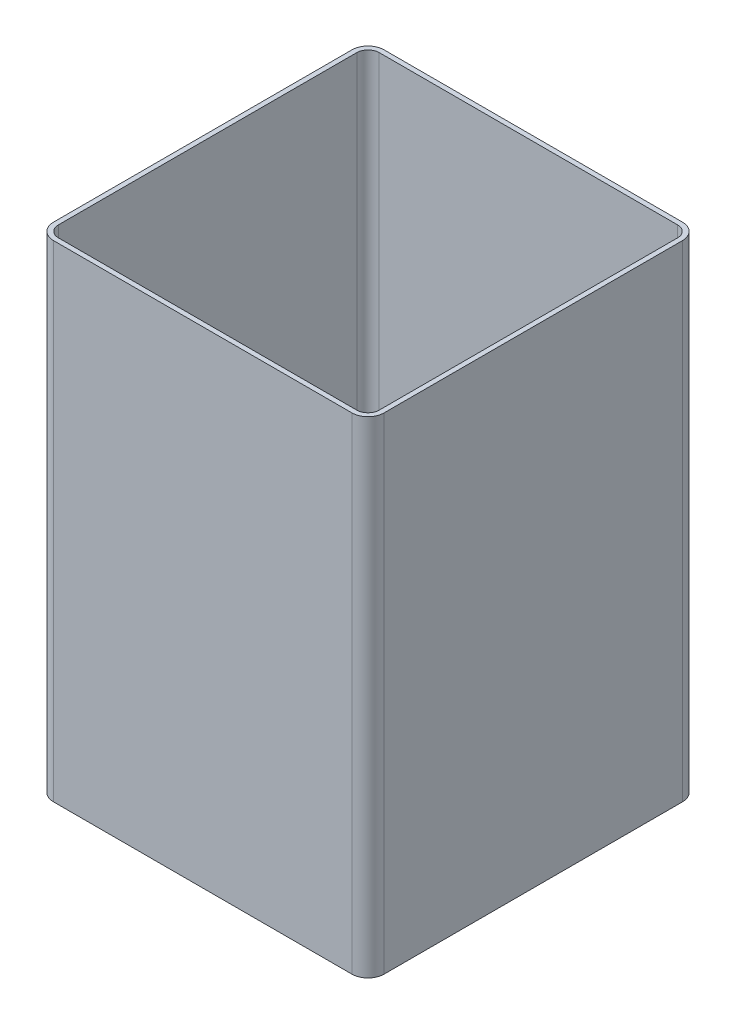
ISO-10303-21;
HEADER;
FILE_DESCRIPTION(('STEP AP214'),'2;1');
FILE_NAME('part.step','',(''),(''),'','','');
FILE_SCHEMA(('AUTOMOTIVE_DESIGN { 1 0 10303 214 1 1 1 1 }'));
ENDSEC;
DATA;
#1=APPLICATION_CONTEXT('core data for automotive mechanical design processes');
#2=APPLICATION_PROTOCOL_DEFINITION('international standard','automotive_design',2000,#1);
#3=PRODUCT_CONTEXT('',#1,'mechanical');
#4=PRODUCT('Part','Part','',(#3));
#5=PRODUCT_RELATED_PRODUCT_CATEGORY('part','',(#4));
#6=PRODUCT_DEFINITION_FORMATION('','',#4);
#7=PRODUCT_DEFINITION_CONTEXT('part definition',#1,'design');
#8=PRODUCT_DEFINITION('design','',#6,#7);
#9=PRODUCT_DEFINITION_SHAPE('','',#8);
#10=(LENGTH_UNIT() NAMED_UNIT(*) SI_UNIT(.MILLI.,.METRE.));
#11=(NAMED_UNIT(*) PLANE_ANGLE_UNIT() SI_UNIT($,.RADIAN.));
#12=(NAMED_UNIT(*) SI_UNIT($,.STERADIAN.) SOLID_ANGLE_UNIT());
#13=UNCERTAINTY_MEASURE_WITH_UNIT(LENGTH_MEASURE(1.E-05),#10,'distance_accuracy_value','');
#14=(GEOMETRIC_REPRESENTATION_CONTEXT(3) GLOBAL_UNCERTAINTY_ASSIGNED_CONTEXT((#13)) GLOBAL_UNIT_ASSIGNED_CONTEXT((#10,
#11,#12)) REPRESENTATION_CONTEXT('',''));
#15=CARTESIAN_POINT('',(0.,0.,0.));
#16=DIRECTION('',(0.,0.,1.));
#17=DIRECTION('',(1.,0.,0.));
#18=AXIS2_PLACEMENT_3D('',#15,#16,#17);
#19=CARTESIAN_POINT('',(103.,303.,103.));
#20=DIRECTION('',(-1.,0.,0.));
#21=DIRECTION('',(0.,0.,1.));
#22=AXIS2_PLACEMENT_3D('',#19,#20,#21);
#23=PLANE('',#22);
#24=DIRECTION('',(0.,0.,-1.));
#25=VECTOR('',#24,1.);
#26=CARTESIAN_POINT('',(103.,0.,103.));
#27=LINE('',#26,#25);
#28=CARTESIAN_POINT('',(103.,0.,93.));
#29=VERTEX_POINT('',#28);
#30=CARTESIAN_POINT('',(103.,0.,-93.));
#31=VERTEX_POINT('',#30);
#32=EDGE_CURVE('E208',#29,#31,#27,.T.);
#33=ORIENTED_EDGE('',*,*,#32,.T.);
#34=DIRECTION('',(0.,-1.,0.));
#35=VECTOR('',#34,1.);
#36=CARTESIAN_POINT('',(103.,303.,-93.));
#37=LINE('',#36,#35);
#38=CARTESIAN_POINT('',(103.,303.,-93.));
#39=VERTEX_POINT('',#38);
#40=EDGE_CURVE('E305',#31,#39,#37,.F.);
#41=ORIENTED_EDGE('',*,*,#40,.T.);
#42=DIRECTION('',(0.,0.,-1.));
#43=VECTOR('',#42,1.);
#44=CARTESIAN_POINT('',(103.,303.,103.));
#45=LINE('',#44,#43);
#46=CARTESIAN_POINT('',(103.,303.,93.));
#47=VERTEX_POINT('',#46);
#48=EDGE_CURVE('E234',#47,#39,#45,.T.);
#49=ORIENTED_EDGE('',*,*,#48,.F.);
#50=DIRECTION('',(0.,-1.,0.));
#51=VECTOR('',#50,1.);
#52=CARTESIAN_POINT('',(103.,303.,93.));
#53=LINE('',#52,#51);
#54=EDGE_CURVE('E301',#47,#29,#53,.T.);
#55=ORIENTED_EDGE('',*,*,#54,.T.);
#56=EDGE_LOOP('',(#33,#41,#49,#55));
#57=FACE_BOUND('',#56,.T.);
#58=ADVANCED_FACE('F39',(#57),#23,.F.);
#59=CARTESIAN_POINT('',(-103.,303.,-103.));
#60=DIRECTION('',(0.,0.,1.));
#61=DIRECTION('',(1.,0.,0.));
#62=AXIS2_PLACEMENT_3D('',#59,#60,#61);
#63=PLANE('',#62);
#64=DIRECTION('',(-1.,0.,0.));
#65=VECTOR('',#64,1.);
#66=CARTESIAN_POINT('',(-103.,0.,-103.));
#67=LINE('',#66,#65);
#68=CARTESIAN_POINT('',(93.,0.,-103.));
#69=VERTEX_POINT('',#68);
#70=CARTESIAN_POINT('',(-93.,0.,-103.));
#71=VERTEX_POINT('',#70);
#72=EDGE_CURVE('E254',#69,#71,#67,.T.);
#73=ORIENTED_EDGE('',*,*,#72,.T.);
#74=DIRECTION('',(0.,-1.,0.));
#75=VECTOR('',#74,1.);
#76=CARTESIAN_POINT('',(-93.,303.,-103.));
#77=LINE('',#76,#75);
#78=CARTESIAN_POINT('',(-93.,303.,-103.));
#79=VERTEX_POINT('',#78);
#80=EDGE_CURVE('E286',#71,#79,#77,.F.);
#81=ORIENTED_EDGE('',*,*,#80,.T.);
#82=DIRECTION('',(-1.,0.,0.));
#83=VECTOR('',#82,1.);
#84=CARTESIAN_POINT('',(-103.,303.,-103.));
#85=LINE('',#84,#83);
#86=CARTESIAN_POINT('',(93.,303.,-103.));
#87=VERTEX_POINT('',#86);
#88=EDGE_CURVE('E238',#87,#79,#85,.T.);
#89=ORIENTED_EDGE('',*,*,#88,.F.);
#90=DIRECTION('',(0.,-1.,0.));
#91=VECTOR('',#90,1.);
#92=CARTESIAN_POINT('',(93.,303.,-103.));
#93=LINE('',#92,#91);
#94=EDGE_CURVE('E282',#87,#69,#93,.T.);
#95=ORIENTED_EDGE('',*,*,#94,.T.);
#96=EDGE_LOOP('',(#73,#81,#89,#95));
#97=FACE_BOUND('',#96,.T.);
#98=ADVANCED_FACE('F351',(#97),#63,.F.);
#99=CARTESIAN_POINT('',(-103.,303.,103.));
#100=DIRECTION('',(1.,0.,0.));
#101=DIRECTION('',(0.,0.,-1.));
#102=AXIS2_PLACEMENT_3D('',#99,#100,#101);
#103=PLANE('',#102);
#104=DIRECTION('',(0.,0.,1.));
#105=VECTOR('',#104,1.);
#106=CARTESIAN_POINT('',(-103.,303.,103.));
#107=LINE('',#106,#105);
#108=CARTESIAN_POINT('',(-103.,303.,-93.));
#109=VERTEX_POINT('',#108);
#110=CARTESIAN_POINT('',(-103.,303.,93.));
#111=VERTEX_POINT('',#110);
#112=EDGE_CURVE('E243',#109,#111,#107,.T.);
#113=ORIENTED_EDGE('',*,*,#112,.F.);
#114=DIRECTION('',(0.,-1.,0.));
#115=VECTOR('',#114,1.);
#116=CARTESIAN_POINT('',(-103.,303.,-93.));
#117=LINE('',#116,#115);
#118=CARTESIAN_POINT('',(-103.,0.,-93.));
#119=VERTEX_POINT('',#118);
#120=EDGE_CURVE('E266',#109,#119,#117,.T.);
#121=ORIENTED_EDGE('',*,*,#120,.T.);
#122=DIRECTION('',(0.,0.,1.));
#123=VECTOR('',#122,1.);
#124=CARTESIAN_POINT('',(-103.,0.,103.));
#125=LINE('',#124,#123);
#126=CARTESIAN_POINT('',(-103.,0.,93.));
#127=VERTEX_POINT('',#126);
#128=EDGE_CURVE('E258',#119,#127,#125,.T.);
#129=ORIENTED_EDGE('',*,*,#128,.T.);
#130=DIRECTION('',(0.,-1.,0.));
#131=VECTOR('',#130,1.);
#132=CARTESIAN_POINT('',(-103.,303.,93.));
#133=LINE('',#132,#131);
#134=EDGE_CURVE('E250',#127,#111,#133,.F.);
#135=ORIENTED_EDGE('',*,*,#134,.T.);
#136=EDGE_LOOP('',(#113,#121,#129,#135));
#137=FACE_BOUND('',#136,.T.);
#138=ADVANCED_FACE('F357',(#137),#103,.F.);
#139=CARTESIAN_POINT('',(-103.,303.,103.));
#140=DIRECTION('',(0.,0.,-1.));
#141=DIRECTION('',(-1.,0.,0.));
#142=AXIS2_PLACEMENT_3D('',#139,#140,#141);
#143=PLANE('',#142);
#144=DIRECTION('',(1.,0.,0.));
#145=VECTOR('',#144,1.);
#146=CARTESIAN_POINT('',(-103.,303.,103.));
#147=LINE('',#146,#145);
#148=CARTESIAN_POINT('',(-93.,303.,103.));
#149=VERTEX_POINT('',#148);
#150=CARTESIAN_POINT('',(93.,303.,103.));
#151=VERTEX_POINT('',#150);
#152=EDGE_CURVE('E247',#149,#151,#147,.T.);
#153=ORIENTED_EDGE('',*,*,#152,.F.);
#154=DIRECTION('',(0.,-1.,0.));
#155=VECTOR('',#154,1.);
#156=CARTESIAN_POINT('',(-93.,303.,103.));
#157=LINE('',#156,#155);
#158=CARTESIAN_POINT('',(-93.,0.,103.));
#159=VERTEX_POINT('',#158);
#160=EDGE_CURVE('E11',#149,#159,#157,.T.);
#161=ORIENTED_EDGE('',*,*,#160,.T.);
#162=DIRECTION('',(1.,0.,0.));
#163=VECTOR('',#162,1.);
#164=CARTESIAN_POINT('',(-103.,0.,103.));
#165=LINE('',#164,#163);
#166=CARTESIAN_POINT('',(93.,0.,103.));
#167=VERTEX_POINT('',#166);
#168=EDGE_CURVE('E239',#159,#167,#165,.T.);
#169=ORIENTED_EDGE('',*,*,#168,.T.);
#170=DIRECTION('',(0.,-1.,0.));
#171=VECTOR('',#170,1.);
#172=CARTESIAN_POINT('',(93.,303.,103.));
#173=LINE('',#172,#171);
#174=EDGE_CURVE('E48',#167,#151,#173,.F.);
#175=ORIENTED_EDGE('',*,*,#174,.T.);
#176=EDGE_LOOP('',(#153,#161,#169,#175));
#177=FACE_BOUND('',#176,.T.);
#178=ADVANCED_FACE('F382',(#177),#143,.F.);
#179=CARTESIAN_POINT('',(0.,303.,0.));
#180=DIRECTION('',(0.,-1.,0.));
#181=DIRECTION('',(0.,0.,-1.));
#182=AXIS2_PLACEMENT_3D('',#179,#180,#181);
#183=PLANE('',#182);
#184=DIRECTION('',(-1.,0.,0.));
#185=VECTOR('',#184,1.);
#186=CARTESIAN_POINT('',(0.,303.,-100.));
#187=LINE('',#186,#185);
#188=CARTESIAN_POINT('',(93.,303.,-100.));
#189=VERTEX_POINT('',#188);
#190=CARTESIAN_POINT('',(-93.,303.,-100.));
#191=VERTEX_POINT('',#190);
#192=EDGE_CURVE('E183',#189,#191,#187,.T.);
#193=ORIENTED_EDGE('',*,*,#192,.F.);
#194=CARTESIAN_POINT('',(93.,303.,-93.));
#195=DIRECTION('',(0.,-1.,0.));
#196=DIRECTION('',(0.,0.,-1.));
#197=AXIS2_PLACEMENT_3D('',#194,#195,#196);
#198=CIRCLE('',#197,7.);
#199=CARTESIAN_POINT('',(100.,303.,-93.));
#200=VERTEX_POINT('',#199);
#201=EDGE_CURVE('E216',#200,#189,#198,.F.);
#202=ORIENTED_EDGE('',*,*,#201,.F.);
#203=DIRECTION('',(0.,0.,-1.));
#204=VECTOR('',#203,1.);
#205=CARTESIAN_POINT('',(100.,303.,0.));
#206=LINE('',#205,#204);
#207=CARTESIAN_POINT('',(100.,303.,93.));
#208=VERTEX_POINT('',#207);
#209=EDGE_CURVE('E55',#208,#200,#206,.T.);
#210=ORIENTED_EDGE('',*,*,#209,.F.);
#211=CARTESIAN_POINT('',(93.,303.,93.));
#212=DIRECTION('',(0.,-1.,0.));
#213=DIRECTION('',(0.,0.,-1.));
#214=AXIS2_PLACEMENT_3D('',#211,#212,#213);
#215=CIRCLE('',#214,7.);
#216=CARTESIAN_POINT('',(93.,303.,100.));
#217=VERTEX_POINT('',#216);
#218=EDGE_CURVE('E186',#217,#208,#215,.F.);
#219=ORIENTED_EDGE('',*,*,#218,.F.);
#220=DIRECTION('',(1.,0.,0.));
#221=VECTOR('',#220,1.);
#222=CARTESIAN_POINT('',(0.,303.,100.));
#223=LINE('',#222,#221);
#224=CARTESIAN_POINT('',(-93.,303.,100.));
#225=VERTEX_POINT('',#224);
#226=EDGE_CURVE('E203',#225,#217,#223,.T.);
#227=ORIENTED_EDGE('',*,*,#226,.F.);
#228=CARTESIAN_POINT('',(-93.,303.,93.));
#229=DIRECTION('',(0.,-1.,0.));
#230=DIRECTION('',(0.,0.,-1.));
#231=AXIS2_PLACEMENT_3D('',#228,#229,#230);
#232=CIRCLE('',#231,7.);
#233=CARTESIAN_POINT('',(-100.,303.,93.));
#234=VERTEX_POINT('',#233);
#235=EDGE_CURVE('E190',#234,#225,#232,.F.);
#236=ORIENTED_EDGE('',*,*,#235,.F.);
#237=DIRECTION('',(0.,0.,1.));
#238=VECTOR('',#237,1.);
#239=CARTESIAN_POINT('',(-100.,303.,0.));
#240=LINE('',#239,#238);
#241=CARTESIAN_POINT('',(-100.,303.,-93.));
#242=VERTEX_POINT('',#241);
#243=EDGE_CURVE('E222',#242,#234,#240,.T.);
#244=ORIENTED_EDGE('',*,*,#243,.F.);
#245=CARTESIAN_POINT('',(-93.,303.,-93.));
#246=DIRECTION('',(0.,-1.,0.));
#247=DIRECTION('',(0.,0.,-1.));
#248=AXIS2_PLACEMENT_3D('',#245,#246,#247);
#249=CIRCLE('',#248,7.);
#250=EDGE_CURVE('E219',#191,#242,#249,.F.);
#251=ORIENTED_EDGE('',*,*,#250,.F.);
#252=EDGE_LOOP('',(#193,#202,#210,#219,#227,#236,#244,#251));
#253=FACE_BOUND('',#252,.T.);
#254=ORIENTED_EDGE('',*,*,#88,.T.);
#255=CARTESIAN_POINT('',(-93.,303.,-93.));
#256=DIRECTION('',(0.,-1.,0.));
#257=DIRECTION('',(0.,0.,-1.));
#258=AXIS2_PLACEMENT_3D('',#255,#256,#257);
#259=CIRCLE('',#258,10.);
#260=EDGE_CURVE('E298',#79,#109,#259,.F.);
#261=ORIENTED_EDGE('',*,*,#260,.T.);
#262=ORIENTED_EDGE('',*,*,#112,.T.);
#263=CARTESIAN_POINT('',(-93.,303.,93.));
#264=DIRECTION('',(0.,-1.,0.));
#265=DIRECTION('',(0.,0.,-1.));
#266=AXIS2_PLACEMENT_3D('',#263,#264,#265);
#267=CIRCLE('',#266,10.);
#268=EDGE_CURVE('E292',#111,#149,#267,.F.);
#269=ORIENTED_EDGE('',*,*,#268,.T.);
#270=ORIENTED_EDGE('',*,*,#152,.T.);
#271=CARTESIAN_POINT('',(93.,303.,93.));
#272=DIRECTION('',(0.,-1.,0.));
#273=DIRECTION('',(0.,0.,-1.));
#274=AXIS2_PLACEMENT_3D('',#271,#272,#273);
#275=CIRCLE('',#274,10.);
#276=EDGE_CURVE('E289',#151,#47,#275,.F.);
#277=ORIENTED_EDGE('',*,*,#276,.T.);
#278=ORIENTED_EDGE('',*,*,#48,.T.);
#279=CARTESIAN_POINT('',(93.,303.,-93.));
#280=DIRECTION('',(0.,-1.,0.));
#281=DIRECTION('',(0.,0.,-1.));
#282=AXIS2_PLACEMENT_3D('',#279,#280,#281);
#283=CIRCLE('',#282,10.);
#284=EDGE_CURVE('E295',#39,#87,#283,.F.);
#285=ORIENTED_EDGE('',*,*,#284,.T.);
#286=EDGE_LOOP('',(#254,#261,#262,#269,#270,#277,#278,#285));
#287=FACE_BOUND('',#286,.T.);
#288=ADVANCED_FACE('F335',(#253,#287),#183,.F.);
#289=CARTESIAN_POINT('',(0.,0.,0.));
#290=DIRECTION('',(0.,-1.,0.));
#291=DIRECTION('',(0.,0.,-1.));
#292=AXIS2_PLACEMENT_3D('',#289,#290,#291);
#293=PLANE('',#292);
#294=ORIENTED_EDGE('',*,*,#128,.F.);
#295=CARTESIAN_POINT('',(-93.,0.,-93.));
#296=DIRECTION('',(0.,-1.,0.));
#297=DIRECTION('',(0.,0.,-1.));
#298=AXIS2_PLACEMENT_3D('',#295,#296,#297);
#299=CIRCLE('',#298,10.);
#300=EDGE_CURVE('E279',#119,#71,#299,.T.);
#301=ORIENTED_EDGE('',*,*,#300,.T.);
#302=ORIENTED_EDGE('',*,*,#72,.F.);
#303=CARTESIAN_POINT('',(93.,0.,-93.));
#304=DIRECTION('',(0.,-1.,0.));
#305=DIRECTION('',(0.,0.,-1.));
#306=AXIS2_PLACEMENT_3D('',#303,#304,#305);
#307=CIRCLE('',#306,10.);
#308=EDGE_CURVE('E276',#69,#31,#307,.T.);
#309=ORIENTED_EDGE('',*,*,#308,.T.);
#310=ORIENTED_EDGE('',*,*,#32,.F.);
#311=CARTESIAN_POINT('',(93.,0.,93.));
#312=DIRECTION('',(0.,-1.,0.));
#313=DIRECTION('',(0.,0.,-1.));
#314=AXIS2_PLACEMENT_3D('',#311,#312,#313);
#315=CIRCLE('',#314,10.);
#316=EDGE_CURVE('E270',#29,#167,#315,.T.);
#317=ORIENTED_EDGE('',*,*,#316,.T.);
#318=ORIENTED_EDGE('',*,*,#168,.F.);
#319=CARTESIAN_POINT('',(-93.,0.,93.));
#320=DIRECTION('',(0.,-1.,0.));
#321=DIRECTION('',(0.,0.,-1.));
#322=AXIS2_PLACEMENT_3D('',#319,#320,#321);
#323=CIRCLE('',#322,10.);
#324=EDGE_CURVE('E273',#159,#127,#323,.T.);
#325=ORIENTED_EDGE('',*,*,#324,.T.);
#326=EDGE_LOOP('',(#294,#301,#302,#309,#310,#317,#318,#325));
#327=FACE_BOUND('',#326,.T.);
#328=ADVANCED_FACE('F366',(#327),#293,.T.);
#329=CARTESIAN_POINT('',(-93.,303.,-93.));
#330=DIRECTION('',(0.,-1.,0.));
#331=DIRECTION('',(0.,0.,-1.));
#332=AXIS2_PLACEMENT_3D('',#329,#330,#331);
#333=CYLINDRICAL_SURFACE('',#332,10.);
#334=ORIENTED_EDGE('',*,*,#260,.F.);
#335=ORIENTED_EDGE('',*,*,#80,.F.);
#336=ORIENTED_EDGE('',*,*,#300,.F.);
#337=ORIENTED_EDGE('',*,*,#120,.F.);
#338=EDGE_LOOP('',(#334,#335,#336,#337));
#339=FACE_BOUND('',#338,.T.);
#340=ADVANCED_FACE('F362',(#339),#333,.T.);
#341=CARTESIAN_POINT('',(93.,303.,-93.));
#342=DIRECTION('',(0.,-1.,0.));
#343=DIRECTION('',(0.,0.,-1.));
#344=AXIS2_PLACEMENT_3D('',#341,#342,#343);
#345=CYLINDRICAL_SURFACE('',#344,10.);
#346=ORIENTED_EDGE('',*,*,#284,.F.);
#347=ORIENTED_EDGE('',*,*,#40,.F.);
#348=ORIENTED_EDGE('',*,*,#308,.F.);
#349=ORIENTED_EDGE('',*,*,#94,.F.);
#350=EDGE_LOOP('',(#346,#347,#348,#349));
#351=FACE_BOUND('',#350,.T.);
#352=ADVANCED_FACE('F365',(#351),#345,.T.);
#353=CARTESIAN_POINT('',(-93.,303.,93.));
#354=DIRECTION('',(0.,-1.,0.));
#355=DIRECTION('',(0.,0.,-1.));
#356=AXIS2_PLACEMENT_3D('',#353,#354,#355);
#357=CYLINDRICAL_SURFACE('',#356,10.);
#358=ORIENTED_EDGE('',*,*,#268,.F.);
#359=ORIENTED_EDGE('',*,*,#134,.F.);
#360=ORIENTED_EDGE('',*,*,#324,.F.);
#361=ORIENTED_EDGE('',*,*,#160,.F.);
#362=EDGE_LOOP('',(#358,#359,#360,#361));
#363=FACE_BOUND('',#362,.T.);
#364=ADVANCED_FACE('F369',(#363),#357,.T.);
#365=CARTESIAN_POINT('',(93.,303.,93.));
#366=DIRECTION('',(0.,-1.,0.));
#367=DIRECTION('',(0.,0.,-1.));
#368=AXIS2_PLACEMENT_3D('',#365,#366,#367);
#369=CYLINDRICAL_SURFACE('',#368,10.);
#370=ORIENTED_EDGE('',*,*,#276,.F.);
#371=ORIENTED_EDGE('',*,*,#174,.F.);
#372=ORIENTED_EDGE('',*,*,#316,.F.);
#373=ORIENTED_EDGE('',*,*,#54,.F.);
#374=EDGE_LOOP('',(#370,#371,#372,#373));
#375=FACE_BOUND('',#374,.T.);
#376=ADVANCED_FACE('F41',(#375),#369,.T.);
#377=CARTESIAN_POINT('',(100.,303.,103.));
#378=DIRECTION('',(-1.,0.,0.));
#379=DIRECTION('',(0.,0.,1.));
#380=AXIS2_PLACEMENT_3D('',#377,#378,#379);
#381=PLANE('',#380);
#382=DIRECTION('',(0.,0.,-1.));
#383=VECTOR('',#382,1.);
#384=CARTESIAN_POINT('',(100.,3.,0.));
#385=LINE('',#384,#383);
#386=CARTESIAN_POINT('',(100.,3.,93.));
#387=VERTEX_POINT('',#386);
#388=CARTESIAN_POINT('',(100.,3.,-93.));
#389=VERTEX_POINT('',#388);
#390=EDGE_CURVE('E179',#387,#389,#385,.T.);
#391=ORIENTED_EDGE('',*,*,#390,.F.);
#392=DIRECTION('',(0.,1.,0.));
#393=VECTOR('',#392,1.);
#394=CARTESIAN_POINT('',(100.,303.,93.));
#395=LINE('',#394,#393);
#396=EDGE_CURVE('E225',#208,#387,#395,.F.);
#397=ORIENTED_EDGE('',*,*,#396,.F.);
#398=ORIENTED_EDGE('',*,*,#209,.T.);
#399=DIRECTION('',(0.,1.,0.));
#400=VECTOR('',#399,1.);
#401=CARTESIAN_POINT('',(100.,303.,-93.));
#402=LINE('',#401,#400);
#403=EDGE_CURVE('E212',#389,#200,#402,.T.);
#404=ORIENTED_EDGE('',*,*,#403,.F.);
#405=EDGE_LOOP('',(#391,#397,#398,#404));
#406=FACE_BOUND('',#405,.T.);
#407=ADVANCED_FACE('F333',(#406),#381,.T.);
#408=CARTESIAN_POINT('',(-103.,303.,-100.));
#409=DIRECTION('',(0.,0.,1.));
#410=DIRECTION('',(1.,0.,0.));
#411=AXIS2_PLACEMENT_3D('',#408,#409,#410);
#412=PLANE('',#411);
#413=DIRECTION('',(-1.,0.,0.));
#414=VECTOR('',#413,1.);
#415=CARTESIAN_POINT('',(0.,3.,-100.));
#416=LINE('',#415,#414);
#417=CARTESIAN_POINT('',(93.,3.,-100.));
#418=VERTEX_POINT('',#417);
#419=CARTESIAN_POINT('',(-93.,3.,-100.));
#420=VERTEX_POINT('',#419);
#421=EDGE_CURVE('E171',#418,#420,#416,.T.);
#422=ORIENTED_EDGE('',*,*,#421,.F.);
#423=DIRECTION('',(0.,1.,0.));
#424=VECTOR('',#423,1.);
#425=CARTESIAN_POINT('',(93.,303.,-100.));
#426=LINE('',#425,#424);
#427=EDGE_CURVE('E167',#189,#418,#426,.F.);
#428=ORIENTED_EDGE('',*,*,#427,.F.);
#429=ORIENTED_EDGE('',*,*,#192,.T.);
#430=DIRECTION('',(0.,1.,0.));
#431=VECTOR('',#430,1.);
#432=CARTESIAN_POINT('',(-93.,303.,-100.));
#433=LINE('',#432,#431);
#434=EDGE_CURVE('E159',#420,#191,#433,.T.);
#435=ORIENTED_EDGE('',*,*,#434,.F.);
#436=EDGE_LOOP('',(#422,#428,#429,#435));
#437=FACE_BOUND('',#436,.T.);
#438=ADVANCED_FACE('F181',(#437),#412,.T.);
#439=CARTESIAN_POINT('',(-100.,303.,103.));
#440=DIRECTION('',(1.,0.,0.));
#441=DIRECTION('',(0.,0.,-1.));
#442=AXIS2_PLACEMENT_3D('',#439,#440,#441);
#443=PLANE('',#442);
#444=ORIENTED_EDGE('',*,*,#243,.T.);
#445=DIRECTION('',(0.,1.,0.));
#446=VECTOR('',#445,1.);
#447=CARTESIAN_POINT('',(-100.,303.,93.));
#448=LINE('',#447,#446);
#449=CARTESIAN_POINT('',(-100.,3.,93.));
#450=VERTEX_POINT('',#449);
#451=EDGE_CURVE('E200',#450,#234,#448,.T.);
#452=ORIENTED_EDGE('',*,*,#451,.F.);
#453=DIRECTION('',(0.,0.,1.));
#454=VECTOR('',#453,1.);
#455=CARTESIAN_POINT('',(-100.,3.,0.));
#456=LINE('',#455,#454);
#457=CARTESIAN_POINT('',(-100.,3.,-93.));
#458=VERTEX_POINT('',#457);
#459=EDGE_CURVE('E178',#458,#450,#456,.T.);
#460=ORIENTED_EDGE('',*,*,#459,.F.);
#461=DIRECTION('',(0.,1.,0.));
#462=VECTOR('',#461,1.);
#463=CARTESIAN_POINT('',(-100.,303.,-93.));
#464=LINE('',#463,#462);
#465=EDGE_CURVE('E162',#242,#458,#464,.F.);
#466=ORIENTED_EDGE('',*,*,#465,.F.);
#467=EDGE_LOOP('',(#444,#452,#460,#466));
#468=FACE_BOUND('',#467,.T.);
#469=ADVANCED_FACE('F442',(#468),#443,.T.);
#470=CARTESIAN_POINT('',(-103.,303.,100.));
#471=DIRECTION('',(0.,0.,-1.));
#472=DIRECTION('',(-1.,0.,0.));
#473=AXIS2_PLACEMENT_3D('',#470,#471,#472);
#474=PLANE('',#473);
#475=ORIENTED_EDGE('',*,*,#226,.T.);
#476=DIRECTION('',(0.,1.,0.));
#477=VECTOR('',#476,1.);
#478=CARTESIAN_POINT('',(93.,303.,100.));
#479=LINE('',#478,#477);
#480=CARTESIAN_POINT('',(93.,3.,100.));
#481=VERTEX_POINT('',#480);
#482=EDGE_CURVE('E209',#481,#217,#479,.T.);
#483=ORIENTED_EDGE('',*,*,#482,.F.);
#484=DIRECTION('',(1.,0.,0.));
#485=VECTOR('',#484,1.);
#486=CARTESIAN_POINT('',(0.,3.,100.));
#487=LINE('',#486,#485);
#488=CARTESIAN_POINT('',(-93.,3.,100.));
#489=VERTEX_POINT('',#488);
#490=EDGE_CURVE('E215',#489,#481,#487,.T.);
#491=ORIENTED_EDGE('',*,*,#490,.F.);
#492=DIRECTION('',(0.,1.,0.));
#493=VECTOR('',#492,1.);
#494=CARTESIAN_POINT('',(-93.,303.,100.));
#495=LINE('',#494,#493);
#496=EDGE_CURVE('E204',#225,#489,#495,.F.);
#497=ORIENTED_EDGE('',*,*,#496,.F.);
#498=EDGE_LOOP('',(#475,#483,#491,#497));
#499=FACE_BOUND('',#498,.T.);
#500=ADVANCED_FACE('F328',(#499),#474,.T.);
#501=CARTESIAN_POINT('',(0.,3.,0.));
#502=DIRECTION('',(0.,-1.,0.));
#503=DIRECTION('',(0.,0.,-1.));
#504=AXIS2_PLACEMENT_3D('',#501,#502,#503);
#505=PLANE('',#504);
#506=ORIENTED_EDGE('',*,*,#459,.T.);
#507=CARTESIAN_POINT('',(-93.,3.,93.));
#508=DIRECTION('',(0.,-1.,0.));
#509=DIRECTION('',(0.,0.,-1.));
#510=AXIS2_PLACEMENT_3D('',#507,#508,#509);
#511=CIRCLE('',#510,7.);
#512=EDGE_CURVE('E194',#489,#450,#511,.T.);
#513=ORIENTED_EDGE('',*,*,#512,.F.);
#514=ORIENTED_EDGE('',*,*,#490,.T.);
#515=CARTESIAN_POINT('',(93.,3.,93.));
#516=DIRECTION('',(0.,-1.,0.));
#517=DIRECTION('',(0.,0.,-1.));
#518=AXIS2_PLACEMENT_3D('',#515,#516,#517);
#519=CIRCLE('',#518,7.);
#520=EDGE_CURVE('E199',#387,#481,#519,.T.);
#521=ORIENTED_EDGE('',*,*,#520,.F.);
#522=ORIENTED_EDGE('',*,*,#390,.T.);
#523=CARTESIAN_POINT('',(93.,3.,-93.));
#524=DIRECTION('',(0.,-1.,0.));
#525=DIRECTION('',(0.,0.,-1.));
#526=AXIS2_PLACEMENT_3D('',#523,#524,#525);
#527=CIRCLE('',#526,7.);
#528=EDGE_CURVE('E168',#418,#389,#527,.T.);
#529=ORIENTED_EDGE('',*,*,#528,.F.);
#530=ORIENTED_EDGE('',*,*,#421,.T.);
#531=CARTESIAN_POINT('',(-93.,3.,-93.));
#532=DIRECTION('',(0.,-1.,0.));
#533=DIRECTION('',(0.,0.,-1.));
#534=AXIS2_PLACEMENT_3D('',#531,#532,#533);
#535=CIRCLE('',#534,7.);
#536=EDGE_CURVE('E155',#458,#420,#535,.T.);
#537=ORIENTED_EDGE('',*,*,#536,.F.);
#538=EDGE_LOOP('',(#506,#513,#514,#521,#522,#529,#530,#537));
#539=FACE_BOUND('',#538,.T.);
#540=ADVANCED_FACE('F172',(#539),#505,.F.);
#541=CARTESIAN_POINT('',(-93.,303.,-93.));
#542=DIRECTION('',(0.,-1.,0.));
#543=DIRECTION('',(0.,0.,-1.));
#544=AXIS2_PLACEMENT_3D('',#541,#542,#543);
#545=CYLINDRICAL_SURFACE('',#544,7.);
#546=ORIENTED_EDGE('',*,*,#250,.T.);
#547=ORIENTED_EDGE('',*,*,#465,.T.);
#548=ORIENTED_EDGE('',*,*,#536,.T.);
#549=ORIENTED_EDGE('',*,*,#434,.T.);
#550=EDGE_LOOP('',(#546,#547,#548,#549));
#551=FACE_BOUND('',#550,.T.);
#552=ADVANCED_FACE('F157',(#551),#545,.F.);
#553=CARTESIAN_POINT('',(93.,303.,-93.));
#554=DIRECTION('',(0.,-1.,0.));
#555=DIRECTION('',(0.,0.,-1.));
#556=AXIS2_PLACEMENT_3D('',#553,#554,#555);
#557=CYLINDRICAL_SURFACE('',#556,7.);
#558=ORIENTED_EDGE('',*,*,#201,.T.);
#559=ORIENTED_EDGE('',*,*,#427,.T.);
#560=ORIENTED_EDGE('',*,*,#528,.T.);
#561=ORIENTED_EDGE('',*,*,#403,.T.);
#562=EDGE_LOOP('',(#558,#559,#560,#561));
#563=FACE_BOUND('',#562,.T.);
#564=ADVANCED_FACE('F338',(#563),#557,.F.);
#565=CARTESIAN_POINT('',(-93.,303.,93.));
#566=DIRECTION('',(0.,-1.,0.));
#567=DIRECTION('',(0.,0.,-1.));
#568=AXIS2_PLACEMENT_3D('',#565,#566,#567);
#569=CYLINDRICAL_SURFACE('',#568,7.);
#570=ORIENTED_EDGE('',*,*,#235,.T.);
#571=ORIENTED_EDGE('',*,*,#496,.T.);
#572=ORIENTED_EDGE('',*,*,#512,.T.);
#573=ORIENTED_EDGE('',*,*,#451,.T.);
#574=EDGE_LOOP('',(#570,#571,#572,#573));
#575=FACE_BOUND('',#574,.T.);
#576=ADVANCED_FACE('F341',(#575),#569,.F.);
#577=CARTESIAN_POINT('',(93.,303.,93.));
#578=DIRECTION('',(0.,-1.,0.));
#579=DIRECTION('',(0.,0.,-1.));
#580=AXIS2_PLACEMENT_3D('',#577,#578,#579);
#581=CYLINDRICAL_SURFACE('',#580,7.);
#582=ORIENTED_EDGE('',*,*,#218,.T.);
#583=ORIENTED_EDGE('',*,*,#396,.T.);
#584=ORIENTED_EDGE('',*,*,#520,.T.);
#585=ORIENTED_EDGE('',*,*,#482,.T.);
#586=EDGE_LOOP('',(#582,#583,#584,#585));
#587=FACE_BOUND('',#586,.T.);
#588=ADVANCED_FACE('F331',(#587),#581,.F.);
#589=CLOSED_SHELL('',(#58,#98,#138,#178,#288,#328,#340,#352,#364,#376,#407,#438,#469,#500,#540,
#552,#564,#576,#588));
#590=MANIFOLD_SOLID_BREP('B2',#589);
#591=ADVANCED_BREP_SHAPE_REPRESENTATION('',(#18,#590),#14);
#592=SHAPE_DEFINITION_REPRESENTATION(#9,#591);
ENDSEC;
END-ISO-10303-21;
